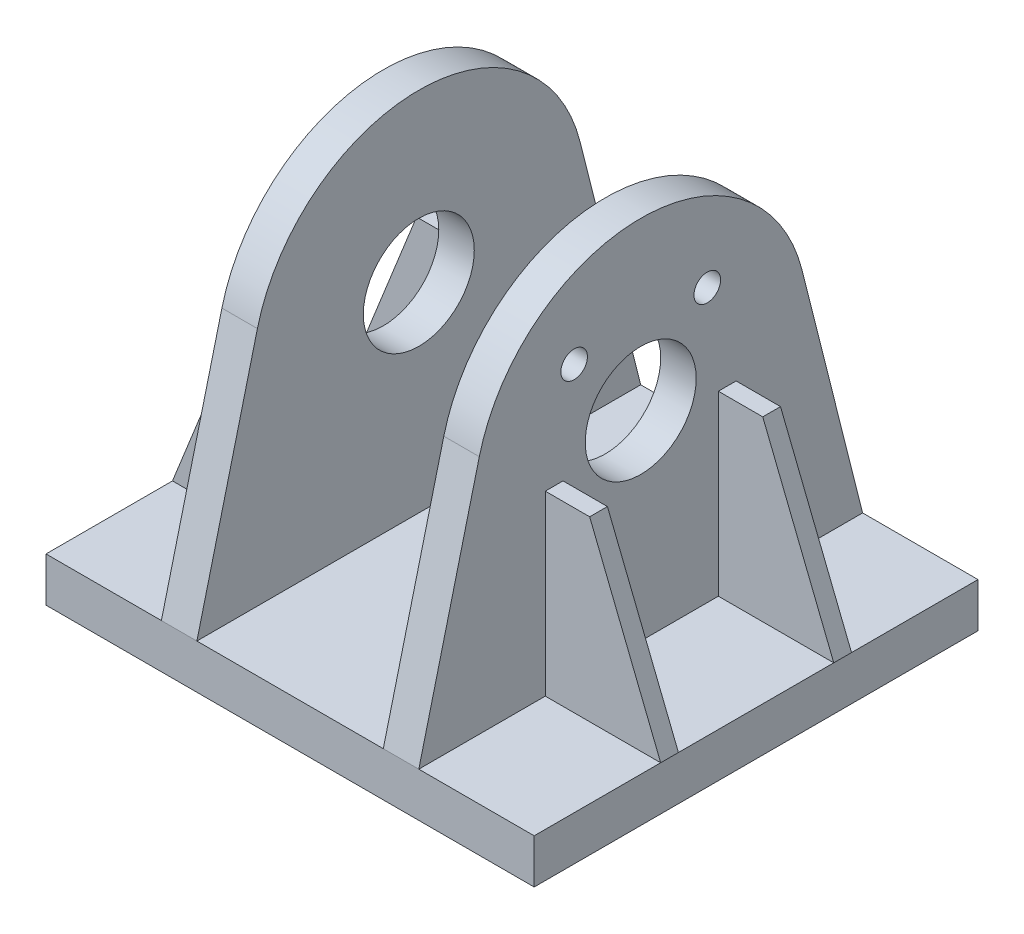
ISO-10303-21;
HEADER;
FILE_DESCRIPTION(('STEP AP214'),'2;1');
FILE_NAME('part.step','',(''),(''),'','','');
FILE_SCHEMA(('AUTOMOTIVE_DESIGN { 1 0 10303 214 1 1 1 1 }'));
ENDSEC;
DATA;
#1=APPLICATION_CONTEXT('core data for automotive mechanical design processes');
#2=APPLICATION_PROTOCOL_DEFINITION('international standard','automotive_design',2000,#1);
#3=PRODUCT_CONTEXT('',#1,'mechanical');
#4=PRODUCT('Part','Part','',(#3));
#5=PRODUCT_RELATED_PRODUCT_CATEGORY('part','',(#4));
#6=PRODUCT_DEFINITION_FORMATION('','',#4);
#7=PRODUCT_DEFINITION_CONTEXT('part definition',#1,'design');
#8=PRODUCT_DEFINITION('design','',#6,#7);
#9=PRODUCT_DEFINITION_SHAPE('','',#8);
#10=(LENGTH_UNIT() NAMED_UNIT(*) SI_UNIT(.MILLI.,.METRE.));
#11=(NAMED_UNIT(*) PLANE_ANGLE_UNIT() SI_UNIT($,.RADIAN.));
#12=(NAMED_UNIT(*) SI_UNIT($,.STERADIAN.) SOLID_ANGLE_UNIT());
#13=UNCERTAINTY_MEASURE_WITH_UNIT(LENGTH_MEASURE(1.E-05),#10,'distance_accuracy_value','');
#14=(GEOMETRIC_REPRESENTATION_CONTEXT(3) GLOBAL_UNCERTAINTY_ASSIGNED_CONTEXT((#13)) GLOBAL_UNIT_ASSIGNED_CONTEXT((#10,
#11,#12)) REPRESENTATION_CONTEXT('',''));
#15=CARTESIAN_POINT('',(0.,0.,0.));
#16=DIRECTION('',(0.,0.,1.));
#17=DIRECTION('',(1.,0.,0.));
#18=AXIS2_PLACEMENT_3D('',#15,#16,#17);
#19=CARTESIAN_POINT('',(-110.,20.,-100.));
#20=DIRECTION('',(1.,0.,0.));
#21=DIRECTION('',(0.,0.,-1.));
#22=AXIS2_PLACEMENT_3D('',#19,#20,#21);
#23=PLANE('',#22);
#24=DIRECTION('',(0.,0.,1.));
#25=VECTOR('',#24,1.);
#26=CARTESIAN_POINT('',(-110.,20.,-100.000125));
#27=LINE('',#26,#25);
#28=CARTESIAN_POINT('',(-110.,20.,-43.));
#29=VERTEX_POINT('',#28);
#30=CARTESIAN_POINT('',(-110.,20.,-35.));
#31=VERTEX_POINT('',#30);
#32=EDGE_CURVE('E224',#29,#31,#27,.T.);
#33=ORIENTED_EDGE('',*,*,#32,.F.);
#34=DIRECTION('',(0.,0.,1.));
#35=VECTOR('',#34,1.);
#36=CARTESIAN_POINT('',(-110.,20.,-100.));
#37=LINE('',#36,#35);
#38=CARTESIAN_POINT('',(-110.,20.,-100.));
#39=VERTEX_POINT('',#38);
#40=EDGE_CURVE('E254',#39,#29,#37,.T.);
#41=ORIENTED_EDGE('',*,*,#40,.F.);
#42=DIRECTION('',(0.,-1.,0.));
#43=VECTOR('',#42,1.);
#44=CARTESIAN_POINT('',(-110.,20.,-100.));
#45=LINE('',#44,#43);
#46=CARTESIAN_POINT('',(-110.,0.,-100.));
#47=VERTEX_POINT('',#46);
#48=EDGE_CURVE('E430',#39,#47,#45,.T.);
#49=ORIENTED_EDGE('',*,*,#48,.T.);
#50=DIRECTION('',(0.,0.,1.));
#51=VECTOR('',#50,1.);
#52=CARTESIAN_POINT('',(-110.,0.,-100.));
#53=LINE('',#52,#51);
#54=CARTESIAN_POINT('',(-110.,0.,100.));
#55=VERTEX_POINT('',#54);
#56=EDGE_CURVE('E435',#47,#55,#53,.T.);
#57=ORIENTED_EDGE('',*,*,#56,.T.);
#58=DIRECTION('',(0.,-1.,0.));
#59=VECTOR('',#58,1.);
#60=CARTESIAN_POINT('',(-110.,20.,100.));
#61=LINE('',#60,#59);
#62=CARTESIAN_POINT('',(-110.,20.,100.));
#63=VERTEX_POINT('',#62);
#64=EDGE_CURVE('E250',#63,#55,#61,.T.);
#65=ORIENTED_EDGE('',*,*,#64,.F.);
#66=CARTESIAN_POINT('',(-110.,20.,43.));
#67=VERTEX_POINT('',#66);
#68=EDGE_CURVE('E240',#67,#63,#37,.T.);
#69=ORIENTED_EDGE('',*,*,#68,.F.);
#70=CARTESIAN_POINT('',(-110.,20.,35.));
#71=VERTEX_POINT('',#70);
#72=EDGE_CURVE('E215',#71,#67,#27,.T.);
#73=ORIENTED_EDGE('',*,*,#72,.F.);
#74=EDGE_CURVE('E251',#31,#71,#37,.T.);
#75=ORIENTED_EDGE('',*,*,#74,.F.);
#76=EDGE_LOOP('',(#33,#41,#49,#57,#65,#69,#73,#75));
#77=FACE_BOUND('',#76,.T.);
#78=ADVANCED_FACE('F34',(#77),#23,.F.);
#79=CARTESIAN_POINT('',(-110.,100.,43.));
#80=DIRECTION('',(0.,0.,1.));
#81=DIRECTION('',(0.,-1.,0.));
#82=AXIS2_PLACEMENT_3D('',#79,#80,#81);
#83=PLANE('',#82);
#84=DIRECTION('',(1.,0.,0.));
#85=VECTOR('',#84,1.);
#86=CARTESIAN_POINT('',(-110.,100.,43.));
#87=LINE('',#86,#85);
#88=CARTESIAN_POINT('',(-78.,100.,43.));
#89=VERTEX_POINT('',#88);
#90=CARTESIAN_POINT('',(-58.,100.,43.));
#91=VERTEX_POINT('',#90);
#92=EDGE_CURVE('E233',#89,#91,#87,.T.);
#93=ORIENTED_EDGE('',*,*,#92,.F.);
#94=DIRECTION('',(-0.371390676354104,-0.928476690885259,0.));
#95=VECTOR('',#94,1.);
#96=CARTESIAN_POINT('',(-78.,100.,43.));
#97=LINE('',#96,#95);
#98=EDGE_CURVE('E218',#89,#67,#97,.T.);
#99=ORIENTED_EDGE('',*,*,#98,.T.);
#100=DIRECTION('',(1.,0.,0.));
#101=VECTOR('',#100,1.);
#102=CARTESIAN_POINT('',(-110.,20.,43.));
#103=LINE('',#102,#101);
#104=CARTESIAN_POINT('',(-58.,20.,43.));
#105=VERTEX_POINT('',#104);
#106=EDGE_CURVE('E231',#67,#105,#103,.T.);
#107=ORIENTED_EDGE('',*,*,#106,.T.);
#108=DIRECTION('',(0.,-1.,0.));
#109=VECTOR('',#108,1.);
#110=CARTESIAN_POINT('',(-58.,100.,43.));
#111=LINE('',#110,#109);
#112=EDGE_CURVE('E526',#91,#105,#111,.T.);
#113=ORIENTED_EDGE('',*,*,#112,.F.);
#114=EDGE_LOOP('',(#93,#99,#107,#113));
#115=FACE_BOUND('',#114,.T.);
#116=ADVANCED_FACE('F229',(#115),#83,.T.);
#117=CARTESIAN_POINT('',(-110.,100.,43.));
#118=DIRECTION('',(0.,1.,0.));
#119=DIRECTION('',(0.,0.,1.));
#120=AXIS2_PLACEMENT_3D('',#117,#118,#119);
#121=PLANE('',#120);
#122=DIRECTION('',(1.,0.,0.));
#123=VECTOR('',#122,1.);
#124=CARTESIAN_POINT('',(-110.,100.,35.));
#125=LINE('',#124,#123);
#126=CARTESIAN_POINT('',(-78.,100.,35.));
#127=VERTEX_POINT('',#126);
#128=CARTESIAN_POINT('',(-58.,100.,35.));
#129=VERTEX_POINT('',#128);
#130=EDGE_CURVE('E517',#127,#129,#125,.T.);
#131=ORIENTED_EDGE('',*,*,#130,.F.);
#132=DIRECTION('',(0.,0.,1.));
#133=VECTOR('',#132,1.);
#134=CARTESIAN_POINT('',(-78.,100.,-100.000125));
#135=LINE('',#134,#133);
#136=EDGE_CURVE('E48',#127,#89,#135,.T.);
#137=ORIENTED_EDGE('',*,*,#136,.T.);
#138=ORIENTED_EDGE('',*,*,#92,.T.);
#139=DIRECTION('',(0.,0.,1.));
#140=VECTOR('',#139,1.);
#141=CARTESIAN_POINT('',(-58.,100.,43.));
#142=LINE('',#141,#140);
#143=EDGE_CURVE('E523',#129,#91,#142,.T.);
#144=ORIENTED_EDGE('',*,*,#143,.F.);
#145=EDGE_LOOP('',(#131,#137,#138,#144));
#146=FACE_BOUND('',#145,.T.);
#147=ADVANCED_FACE('F638',(#146),#121,.T.);
#148=CARTESIAN_POINT('',(-110.,100.,35.));
#149=DIRECTION('',(0.,0.,-1.));
#150=DIRECTION('',(0.,1.,0.));
#151=AXIS2_PLACEMENT_3D('',#148,#149,#150);
#152=PLANE('',#151);
#153=DIRECTION('',(1.,0.,0.));
#154=VECTOR('',#153,1.);
#155=CARTESIAN_POINT('',(-110.,20.,35.));
#156=LINE('',#155,#154);
#157=CARTESIAN_POINT('',(-58.,20.,35.));
#158=VERTEX_POINT('',#157);
#159=EDGE_CURVE('E243',#71,#158,#156,.T.);
#160=ORIENTED_EDGE('',*,*,#159,.F.);
#161=DIRECTION('',(0.371390676354104,0.928476690885259,0.));
#162=VECTOR('',#161,1.);
#163=CARTESIAN_POINT('',(-82.4137931034483,88.9655172413793,35.));
#164=LINE('',#163,#162);
#165=EDGE_CURVE('E219',#71,#127,#164,.T.);
#166=ORIENTED_EDGE('',*,*,#165,.T.);
#167=ORIENTED_EDGE('',*,*,#130,.T.);
#168=DIRECTION('',(0.,1.,0.));
#169=VECTOR('',#168,1.);
#170=CARTESIAN_POINT('',(-58.,100.,35.));
#171=LINE('',#170,#169);
#172=EDGE_CURVE('E244',#158,#129,#171,.T.);
#173=ORIENTED_EDGE('',*,*,#172,.F.);
#174=EDGE_LOOP('',(#160,#166,#167,#173));
#175=FACE_BOUND('',#174,.T.);
#176=ADVANCED_FACE('F642',(#175),#152,.T.);
#177=CARTESIAN_POINT('',(-110.,100.,-35.));
#178=DIRECTION('',(0.,0.,1.));
#179=DIRECTION('',(0.,-1.,0.));
#180=AXIS2_PLACEMENT_3D('',#177,#178,#179);
#181=PLANE('',#180);
#182=DIRECTION('',(1.,0.,0.));
#183=VECTOR('',#182,1.);
#184=CARTESIAN_POINT('',(-110.,100.,-35.));
#185=LINE('',#184,#183);
#186=CARTESIAN_POINT('',(-78.,100.,-35.));
#187=VERTEX_POINT('',#186);
#188=CARTESIAN_POINT('',(-58.,100.,-35.));
#189=VERTEX_POINT('',#188);
#190=EDGE_CURVE('E528',#187,#189,#185,.T.);
#191=ORIENTED_EDGE('',*,*,#190,.F.);
#192=DIRECTION('',(-0.371390676354104,-0.928476690885259,0.));
#193=VECTOR('',#192,1.);
#194=CARTESIAN_POINT('',(-82.4137931034483,88.9655172413793,-35.));
#195=LINE('',#194,#193);
#196=EDGE_CURVE('E547',#187,#31,#195,.T.);
#197=ORIENTED_EDGE('',*,*,#196,.T.);
#198=DIRECTION('',(1.,0.,0.));
#199=VECTOR('',#198,1.);
#200=CARTESIAN_POINT('',(-110.,20.,-35.));
#201=LINE('',#200,#199);
#202=CARTESIAN_POINT('',(-58.,20.,-35.));
#203=VERTEX_POINT('',#202);
#204=EDGE_CURVE('E535',#31,#203,#201,.T.);
#205=ORIENTED_EDGE('',*,*,#204,.T.);
#206=DIRECTION('',(0.,-1.,0.));
#207=VECTOR('',#206,1.);
#208=CARTESIAN_POINT('',(-58.,100.,-35.));
#209=LINE('',#208,#207);
#210=EDGE_CURVE('E543',#189,#203,#209,.T.);
#211=ORIENTED_EDGE('',*,*,#210,.F.);
#212=EDGE_LOOP('',(#191,#197,#205,#211));
#213=FACE_BOUND('',#212,.T.);
#214=ADVANCED_FACE('F648',(#213),#181,.T.);
#215=CARTESIAN_POINT('',(-110.,100.,-35.));
#216=DIRECTION('',(0.,1.,0.));
#217=DIRECTION('',(0.,0.,1.));
#218=AXIS2_PLACEMENT_3D('',#215,#216,#217);
#219=PLANE('',#218);
#220=DIRECTION('',(1.,0.,0.));
#221=VECTOR('',#220,1.);
#222=CARTESIAN_POINT('',(-110.,100.,-43.));
#223=LINE('',#222,#221);
#224=CARTESIAN_POINT('',(-78.,100.,-43.));
#225=VERTEX_POINT('',#224);
#226=CARTESIAN_POINT('',(-58.,100.,-43.));
#227=VERTEX_POINT('',#226);
#228=EDGE_CURVE('E530',#225,#227,#223,.T.);
#229=ORIENTED_EDGE('',*,*,#228,.F.);
#230=EDGE_CURVE('E56',#225,#187,#135,.T.);
#231=ORIENTED_EDGE('',*,*,#230,.T.);
#232=ORIENTED_EDGE('',*,*,#190,.T.);
#233=DIRECTION('',(0.,0.,1.));
#234=VECTOR('',#233,1.);
#235=CARTESIAN_POINT('',(-58.,100.,-35.));
#236=LINE('',#235,#234);
#237=EDGE_CURVE('E540',#227,#189,#236,.T.);
#238=ORIENTED_EDGE('',*,*,#237,.F.);
#239=EDGE_LOOP('',(#229,#231,#232,#238));
#240=FACE_BOUND('',#239,.T.);
#241=ADVANCED_FACE('F652',(#240),#219,.T.);
#242=CARTESIAN_POINT('',(-110.,100.,-43.));
#243=DIRECTION('',(0.,0.,-1.));
#244=DIRECTION('',(0.,1.,0.));
#245=AXIS2_PLACEMENT_3D('',#242,#243,#244);
#246=PLANE('',#245);
#247=DIRECTION('',(1.,0.,0.));
#248=VECTOR('',#247,1.);
#249=CARTESIAN_POINT('',(-110.,20.,-43.));
#250=LINE('',#249,#248);
#251=CARTESIAN_POINT('',(-58.,20.,-43.));
#252=VERTEX_POINT('',#251);
#253=EDGE_CURVE('E532',#29,#252,#250,.T.);
#254=ORIENTED_EDGE('',*,*,#253,.F.);
#255=DIRECTION('',(0.371390676354104,0.928476690885259,0.));
#256=VECTOR('',#255,1.);
#257=CARTESIAN_POINT('',(-82.4137931034483,88.9655172413793,-43.));
#258=LINE('',#257,#256);
#259=EDGE_CURVE('E11',#29,#225,#258,.T.);
#260=ORIENTED_EDGE('',*,*,#259,.T.);
#261=ORIENTED_EDGE('',*,*,#228,.T.);
#262=DIRECTION('',(0.,1.,0.));
#263=VECTOR('',#262,1.);
#264=CARTESIAN_POINT('',(-58.,100.,-43.));
#265=LINE('',#264,#263);
#266=EDGE_CURVE('E537',#252,#227,#265,.T.);
#267=ORIENTED_EDGE('',*,*,#266,.F.);
#268=EDGE_LOOP('',(#254,#260,#261,#267));
#269=FACE_BOUND('',#268,.T.);
#270=ADVANCED_FACE('F656',(#269),#246,.T.);
#271=CARTESIAN_POINT('',(0.,20.,0.));
#272=DIRECTION('',(0.,1.,0.));
#273=DIRECTION('',(0.,0.,1.));
#274=AXIS2_PLACEMENT_3D('',#271,#272,#273);
#275=PLANE('',#274);
#276=ORIENTED_EDGE('',*,*,#204,.F.);
#277=ORIENTED_EDGE('',*,*,#74,.T.);
#278=ORIENTED_EDGE('',*,*,#159,.T.);
#279=DIRECTION('',(0.,0.,1.));
#280=VECTOR('',#279,1.);
#281=CARTESIAN_POINT('',(-58.,20.,-100.));
#282=LINE('',#281,#280);
#283=EDGE_CURVE('E262',#203,#158,#282,.T.);
#284=ORIENTED_EDGE('',*,*,#283,.F.);
#285=EDGE_LOOP('',(#276,#277,#278,#284));
#286=FACE_BOUND('',#285,.T.);
#287=ADVANCED_FACE('F660',(#286),#275,.T.);
#288=ORIENTED_EDGE('',*,*,#106,.F.);
#289=ORIENTED_EDGE('',*,*,#68,.T.);
#290=DIRECTION('',(1.,0.,0.));
#291=VECTOR('',#290,1.);
#292=CARTESIAN_POINT('',(-110.,20.,100.));
#293=LINE('',#292,#291);
#294=CARTESIAN_POINT('',(-58.,20.,100.));
#295=VERTEX_POINT('',#294);
#296=EDGE_CURVE('E423',#63,#295,#293,.T.);
#297=ORIENTED_EDGE('',*,*,#296,.T.);
#298=EDGE_CURVE('E242',#105,#295,#282,.T.);
#299=ORIENTED_EDGE('',*,*,#298,.F.);
#300=EDGE_LOOP('',(#288,#289,#297,#299));
#301=FACE_BOUND('',#300,.T.);
#302=ADVANCED_FACE('F238',(#301),#275,.T.);
#303=DIRECTION('',(0.,0.,-1.));
#304=VECTOR('',#303,1.);
#305=CARTESIAN_POINT('',(110.,20.,-100.));
#306=LINE('',#305,#304);
#307=CARTESIAN_POINT('',(110.,20.,35.));
#308=VERTEX_POINT('',#307);
#309=CARTESIAN_POINT('',(110.,20.,-35.));
#310=VERTEX_POINT('',#309);
#311=EDGE_CURVE('E458',#308,#310,#306,.T.);
#312=ORIENTED_EDGE('',*,*,#311,.T.);
#313=DIRECTION('',(-1.,0.,0.));
#314=VECTOR('',#313,1.);
#315=CARTESIAN_POINT('',(110.,20.,-35.));
#316=LINE('',#315,#314);
#317=CARTESIAN_POINT('',(58.,20.,-35.));
#318=VERTEX_POINT('',#317);
#319=EDGE_CURVE('E293',#310,#318,#316,.T.);
#320=ORIENTED_EDGE('',*,*,#319,.T.);
#321=DIRECTION('',(0.,0.,-1.));
#322=VECTOR('',#321,1.);
#323=CARTESIAN_POINT('',(58.,20.,-100.));
#324=LINE('',#323,#322);
#325=CARTESIAN_POINT('',(58.,20.,35.));
#326=VERTEX_POINT('',#325);
#327=EDGE_CURVE('E395',#326,#318,#324,.T.);
#328=ORIENTED_EDGE('',*,*,#327,.F.);
#329=DIRECTION('',(-1.,0.,0.));
#330=VECTOR('',#329,1.);
#331=CARTESIAN_POINT('',(110.,20.,35.));
#332=LINE('',#331,#330);
#333=EDGE_CURVE('E313',#308,#326,#332,.T.);
#334=ORIENTED_EDGE('',*,*,#333,.F.);
#335=EDGE_LOOP('',(#312,#320,#328,#334));
#336=FACE_BOUND('',#335,.T.);
#337=ADVANCED_FACE('F621',(#336),#275,.T.);
#338=CARTESIAN_POINT('',(58.,20.,-43.));
#339=VERTEX_POINT('',#338);
#340=CARTESIAN_POINT('',(58.,20.,-100.));
#341=VERTEX_POINT('',#340);
#342=EDGE_CURVE('E392',#339,#341,#324,.T.);
#343=ORIENTED_EDGE('',*,*,#342,.F.);
#344=DIRECTION('',(-1.,0.,0.));
#345=VECTOR('',#344,1.);
#346=CARTESIAN_POINT('',(110.,20.,-43.));
#347=LINE('',#346,#345);
#348=CARTESIAN_POINT('',(110.,20.,-43.));
#349=VERTEX_POINT('',#348);
#350=EDGE_CURVE('E291',#349,#339,#347,.T.);
#351=ORIENTED_EDGE('',*,*,#350,.F.);
#352=CARTESIAN_POINT('',(110.,20.,-100.));
#353=VERTEX_POINT('',#352);
#354=EDGE_CURVE('E425',#349,#353,#306,.T.);
#355=ORIENTED_EDGE('',*,*,#354,.T.);
#356=DIRECTION('',(-1.,0.,0.));
#357=VECTOR('',#356,1.);
#358=CARTESIAN_POINT('',(-110.,20.,-100.));
#359=LINE('',#358,#357);
#360=EDGE_CURVE('E440',#353,#341,#359,.T.);
#361=ORIENTED_EDGE('',*,*,#360,.T.);
#362=EDGE_LOOP('',(#343,#351,#355,#361));
#363=FACE_BOUND('',#362,.T.);
#364=ADVANCED_FACE('F465',(#363),#275,.T.);
#365=CARTESIAN_POINT('',(58.,220.,-100.));
#366=DIRECTION('',(-1.,0.,0.));
#367=DIRECTION('',(0.,0.,1.));
#368=AXIS2_PLACEMENT_3D('',#365,#366,#367);
#369=PLANE('',#368);
#370=CARTESIAN_POINT('',(58.,143.,-30.));
#371=DIRECTION('',(1.,0.,0.));
#372=DIRECTION('',(0.,0.,-1.));
#373=AXIS2_PLACEMENT_3D('',#370,#371,#372);
#374=CIRCLE('',#373,6.);
#375=CARTESIAN_POINT('',(58.,143.,-36.));
#376=VERTEX_POINT('',#375);
#377=EDGE_CURVE('E561',#376,#376,#374,.T.);
#378=ORIENTED_EDGE('',*,*,#377,.F.);
#379=EDGE_LOOP('',(#378));
#380=FACE_BOUND('',#379,.T.);
#381=CARTESIAN_POINT('',(58.,143.,30.));
#382=DIRECTION('',(1.,0.,0.));
#383=DIRECTION('',(0.,0.,-1.));
#384=AXIS2_PLACEMENT_3D('',#381,#382,#383);
#385=CIRCLE('',#384,6.);
#386=CARTESIAN_POINT('',(58.,143.,24.));
#387=VERTEX_POINT('',#386);
#388=EDGE_CURVE('E555',#387,#387,#385,.T.);
#389=ORIENTED_EDGE('',*,*,#388,.F.);
#390=EDGE_LOOP('',(#389));
#391=FACE_BOUND('',#390,.T.);
#392=CARTESIAN_POINT('',(58.,110.,0.));
#393=DIRECTION('',(1.,0.,0.));
#394=DIRECTION('',(0.,0.,-1.));
#395=AXIS2_PLACEMENT_3D('',#392,#393,#394);
#396=CIRCLE('',#395,25.);
#397=CARTESIAN_POINT('',(58.,110.,-25.));
#398=VERTEX_POINT('',#397);
#399=EDGE_CURVE('E377',#398,#398,#396,.T.);
#400=ORIENTED_EDGE('',*,*,#399,.F.);
#401=EDGE_LOOP('',(#400));
#402=FACE_BOUND('',#401,.T.);
#403=DIRECTION('',(0.,-1.,0.));
#404=VECTOR('',#403,1.);
#405=CARTESIAN_POINT('',(58.,100.,-35.));
#406=LINE('',#405,#404);
#407=CARTESIAN_POINT('',(58.,100.,-35.));
#408=VERTEX_POINT('',#407);
#409=EDGE_CURVE('E492',#408,#318,#406,.T.);
#410=ORIENTED_EDGE('',*,*,#409,.F.);
#411=DIRECTION('',(0.,0.,1.));
#412=VECTOR('',#411,1.);
#413=CARTESIAN_POINT('',(58.,100.,-35.));
#414=LINE('',#413,#412);
#415=CARTESIAN_POINT('',(58.,100.,-43.));
#416=VERTEX_POINT('',#415);
#417=EDGE_CURVE('E295',#416,#408,#414,.T.);
#418=ORIENTED_EDGE('',*,*,#417,.F.);
#419=DIRECTION('',(0.,1.,0.));
#420=VECTOR('',#419,1.);
#421=CARTESIAN_POINT('',(58.,100.,-43.));
#422=LINE('',#421,#420);
#423=EDGE_CURVE('E290',#339,#416,#422,.T.);
#424=ORIENTED_EDGE('',*,*,#423,.F.);
#425=ORIENTED_EDGE('',*,*,#342,.T.);
#426=DIRECTION('',(0.,-0.969736936832039,-0.244152152035599));
#427=VECTOR('',#426,1.);
#428=CARTESIAN_POINT('',(58.,20.,-100.));
#429=LINE('',#428,#427);
#430=CARTESIAN_POINT('',(58.,128.31141140267,-72.7302702624029));
#431=VERTEX_POINT('',#430);
#432=EDGE_CURVE('E320',#431,#341,#429,.T.);
#433=ORIENTED_EDGE('',*,*,#432,.F.);
#434=CARTESIAN_POINT('',(58.,110.,0.));
#435=DIRECTION('',(-1.,0.,0.));
#436=DIRECTION('',(0.,0.,-1.));
#437=AXIS2_PLACEMENT_3D('',#434,#435,#436);
#438=CIRCLE('',#437,75.);
#439=CARTESIAN_POINT('',(58.,128.31141140267,72.7302702624029));
#440=VERTEX_POINT('',#439);
#441=EDGE_CURVE('E318',#440,#431,#438,.T.);
#442=ORIENTED_EDGE('',*,*,#441,.F.);
#443=DIRECTION('',(0.,0.969736936832039,-0.244152152035599));
#444=VECTOR('',#443,1.);
#445=CARTESIAN_POINT('',(58.,128.31141140267,72.7302702624029));
#446=LINE('',#445,#444);
#447=CARTESIAN_POINT('',(58.,20.,100.));
#448=VERTEX_POINT('',#447);
#449=EDGE_CURVE('E323',#448,#440,#446,.T.);
#450=ORIENTED_EDGE('',*,*,#449,.F.);
#451=CARTESIAN_POINT('',(58.,20.,43.));
#452=VERTEX_POINT('',#451);
#453=EDGE_CURVE('E393',#448,#452,#324,.T.);
#454=ORIENTED_EDGE('',*,*,#453,.T.);
#455=DIRECTION('',(0.,-1.,0.));
#456=VECTOR('',#455,1.);
#457=CARTESIAN_POINT('',(58.,100.,43.));
#458=LINE('',#457,#456);
#459=CARTESIAN_POINT('',(58.,100.,43.));
#460=VERTEX_POINT('',#459);
#461=EDGE_CURVE('E300',#460,#452,#458,.T.);
#462=ORIENTED_EDGE('',*,*,#461,.F.);
#463=DIRECTION('',(0.,0.,1.));
#464=VECTOR('',#463,1.);
#465=CARTESIAN_POINT('',(58.,100.,43.));
#466=LINE('',#465,#464);
#467=CARTESIAN_POINT('',(58.,100.,35.));
#468=VERTEX_POINT('',#467);
#469=EDGE_CURVE('E306',#468,#460,#466,.T.);
#470=ORIENTED_EDGE('',*,*,#469,.F.);
#471=DIRECTION('',(0.,1.,0.));
#472=VECTOR('',#471,1.);
#473=CARTESIAN_POINT('',(58.,100.,35.));
#474=LINE('',#473,#472);
#475=EDGE_CURVE('E303',#326,#468,#474,.T.);
#476=ORIENTED_EDGE('',*,*,#475,.F.);
#477=ORIENTED_EDGE('',*,*,#327,.T.);
#478=EDGE_LOOP('',(#410,#418,#424,#425,#433,#442,#450,#454,#462,#470,#476,#477));
#479=FACE_BOUND('',#478,.T.);
#480=ADVANCED_FACE('F487',(#380,#391,#402,#479),#369,.F.);
#481=CARTESIAN_POINT('',(110.,20.,100.));
#482=VERTEX_POINT('',#481);
#483=CARTESIAN_POINT('',(110.,20.,43.));
#484=VERTEX_POINT('',#483);
#485=EDGE_CURVE('E417',#482,#484,#306,.T.);
#486=ORIENTED_EDGE('',*,*,#485,.T.);
#487=DIRECTION('',(-1.,0.,0.));
#488=VECTOR('',#487,1.);
#489=CARTESIAN_POINT('',(110.,20.,43.));
#490=LINE('',#489,#488);
#491=EDGE_CURVE('E316',#484,#452,#490,.T.);
#492=ORIENTED_EDGE('',*,*,#491,.T.);
#493=ORIENTED_EDGE('',*,*,#453,.F.);
#494=EDGE_CURVE('E409',#448,#482,#293,.T.);
#495=ORIENTED_EDGE('',*,*,#494,.T.);
#496=EDGE_LOOP('',(#486,#492,#493,#495));
#497=FACE_BOUND('',#496,.T.);
#498=ADVANCED_FACE('F579',(#497),#275,.T.);
#499=CARTESIAN_POINT('',(-42.,20.,100.));
#500=VERTEX_POINT('',#499);
#501=CARTESIAN_POINT('',(42.,20.,100.));
#502=VERTEX_POINT('',#501);
#503=EDGE_CURVE('E411',#500,#502,#293,.T.);
#504=ORIENTED_EDGE('',*,*,#503,.T.);
#505=DIRECTION('',(0.,0.,1.));
#506=VECTOR('',#505,1.);
#507=CARTESIAN_POINT('',(42.,20.,-100.));
#508=LINE('',#507,#506);
#509=CARTESIAN_POINT('',(42.,20.,-100.));
#510=VERTEX_POINT('',#509);
#511=EDGE_CURVE('E389',#510,#502,#508,.T.);
#512=ORIENTED_EDGE('',*,*,#511,.F.);
#513=CARTESIAN_POINT('',(-42.,20.,-100.));
#514=VERTEX_POINT('',#513);
#515=EDGE_CURVE('E412',#510,#514,#359,.T.);
#516=ORIENTED_EDGE('',*,*,#515,.T.);
#517=DIRECTION('',(0.,0.,-1.));
#518=VECTOR('',#517,1.);
#519=CARTESIAN_POINT('',(-42.,20.,-100.));
#520=LINE('',#519,#518);
#521=EDGE_CURVE('E407',#500,#514,#520,.T.);
#522=ORIENTED_EDGE('',*,*,#521,.F.);
#523=EDGE_LOOP('',(#504,#512,#516,#522));
#524=FACE_BOUND('',#523,.T.);
#525=ADVANCED_FACE('F597',(#524),#275,.T.);
#526=ORIENTED_EDGE('',*,*,#253,.T.);
#527=CARTESIAN_POINT('',(-58.,20.,-100.));
#528=VERTEX_POINT('',#527);
#529=EDGE_CURVE('E403',#528,#252,#282,.T.);
#530=ORIENTED_EDGE('',*,*,#529,.F.);
#531=EDGE_CURVE('E439',#528,#39,#359,.T.);
#532=ORIENTED_EDGE('',*,*,#531,.T.);
#533=ORIENTED_EDGE('',*,*,#40,.T.);
#534=EDGE_LOOP('',(#526,#530,#532,#533));
#535=FACE_BOUND('',#534,.T.);
#536=ADVANCED_FACE('F747',(#535),#275,.T.);
#537=CARTESIAN_POINT('',(-110.,20.,100.));
#538=DIRECTION('',(0.,0.,-1.));
#539=DIRECTION('',(-1.,0.,0.));
#540=AXIS2_PLACEMENT_3D('',#537,#538,#539);
#541=PLANE('',#540);
#542=ORIENTED_EDGE('',*,*,#494,.F.);
#543=DIRECTION('',(1.,0.,0.));
#544=VECTOR('',#543,1.);
#545=CARTESIAN_POINT('',(-110.000025,20.,100.));
#546=LINE('',#545,#544);
#547=EDGE_CURVE('E339',#502,#448,#546,.T.);
#548=ORIENTED_EDGE('',*,*,#547,.F.);
#549=ORIENTED_EDGE('',*,*,#503,.F.);
#550=EDGE_CURVE('E330',#295,#500,#546,.T.);
#551=ORIENTED_EDGE('',*,*,#550,.F.);
#552=ORIENTED_EDGE('',*,*,#296,.F.);
#553=ORIENTED_EDGE('',*,*,#64,.T.);
#554=DIRECTION('',(1.,0.,0.));
#555=VECTOR('',#554,1.);
#556=CARTESIAN_POINT('',(-110.,0.,100.));
#557=LINE('',#556,#555);
#558=CARTESIAN_POINT('',(110.,0.,100.));
#559=VERTEX_POINT('',#558);
#560=EDGE_CURVE('E433',#55,#559,#557,.T.);
#561=ORIENTED_EDGE('',*,*,#560,.T.);
#562=DIRECTION('',(0.,-1.,0.));
#563=VECTOR('',#562,1.);
#564=CARTESIAN_POINT('',(110.,20.,100.));
#565=LINE('',#564,#563);
#566=EDGE_CURVE('E270',#482,#559,#565,.T.);
#567=ORIENTED_EDGE('',*,*,#566,.F.);
#568=EDGE_LOOP('',(#542,#548,#549,#551,#552,#553,#561,#567));
#569=FACE_BOUND('',#568,.T.);
#570=ADVANCED_FACE('F603',(#569),#541,.F.);
#571=CARTESIAN_POINT('',(110.,20.,-100.));
#572=DIRECTION('',(-1.,0.,0.));
#573=DIRECTION('',(0.,0.,1.));
#574=AXIS2_PLACEMENT_3D('',#571,#572,#573);
#575=PLANE('',#574);
#576=ORIENTED_EDGE('',*,*,#354,.F.);
#577=DIRECTION('',(0.,0.,1.));
#578=VECTOR('',#577,1.);
#579=CARTESIAN_POINT('',(110.,20.,-100.000125));
#580=LINE('',#579,#578);
#581=EDGE_CURVE('E508',#349,#310,#580,.T.);
#582=ORIENTED_EDGE('',*,*,#581,.T.);
#583=ORIENTED_EDGE('',*,*,#311,.F.);
#584=EDGE_CURVE('E511',#308,#484,#580,.T.);
#585=ORIENTED_EDGE('',*,*,#584,.T.);
#586=ORIENTED_EDGE('',*,*,#485,.F.);
#587=ORIENTED_EDGE('',*,*,#566,.T.);
#588=DIRECTION('',(0.,0.,-1.));
#589=VECTOR('',#588,1.);
#590=CARTESIAN_POINT('',(110.,0.,-100.));
#591=LINE('',#590,#589);
#592=CARTESIAN_POINT('',(110.,0.,-100.));
#593=VERTEX_POINT('',#592);
#594=EDGE_CURVE('E255',#559,#593,#591,.T.);
#595=ORIENTED_EDGE('',*,*,#594,.T.);
#596=DIRECTION('',(0.,-1.,0.));
#597=VECTOR('',#596,1.);
#598=CARTESIAN_POINT('',(110.,20.,-100.));
#599=LINE('',#598,#597);
#600=EDGE_CURVE('E428',#353,#593,#599,.T.);
#601=ORIENTED_EDGE('',*,*,#600,.F.);
#602=EDGE_LOOP('',(#576,#582,#583,#585,#586,#587,#595,#601));
#603=FACE_BOUND('',#602,.T.);
#604=ADVANCED_FACE('F468',(#603),#575,.F.);
#605=CARTESIAN_POINT('',(-110.,20.,-100.));
#606=DIRECTION('',(0.,0.,1.));
#607=DIRECTION('',(1.,0.,0.));
#608=AXIS2_PLACEMENT_3D('',#605,#606,#607);
#609=PLANE('',#608);
#610=ORIENTED_EDGE('',*,*,#531,.F.);
#611=DIRECTION('',(1.,0.,0.));
#612=VECTOR('',#611,1.);
#613=CARTESIAN_POINT('',(-110.000025,20.,-100.));
#614=LINE('',#613,#612);
#615=EDGE_CURVE('E341',#528,#514,#614,.T.);
#616=ORIENTED_EDGE('',*,*,#615,.T.);
#617=ORIENTED_EDGE('',*,*,#515,.F.);
#618=EDGE_CURVE('E474',#510,#341,#614,.T.);
#619=ORIENTED_EDGE('',*,*,#618,.T.);
#620=ORIENTED_EDGE('',*,*,#360,.F.);
#621=ORIENTED_EDGE('',*,*,#600,.T.);
#622=DIRECTION('',(-1.,0.,0.));
#623=VECTOR('',#622,1.);
#624=CARTESIAN_POINT('',(-110.,0.,-100.));
#625=LINE('',#624,#623);
#626=EDGE_CURVE('E252',#593,#47,#625,.T.);
#627=ORIENTED_EDGE('',*,*,#626,.T.);
#628=ORIENTED_EDGE('',*,*,#48,.F.);
#629=EDGE_LOOP('',(#610,#616,#617,#619,#620,#621,#627,#628));
#630=FACE_BOUND('',#629,.T.);
#631=ADVANCED_FACE('F473',(#630),#609,.F.);
#632=CARTESIAN_POINT('',(0.,0.,0.));
#633=DIRECTION('',(0.,1.,0.));
#634=DIRECTION('',(0.,0.,1.));
#635=AXIS2_PLACEMENT_3D('',#632,#633,#634);
#636=PLANE('',#635);
#637=ORIENTED_EDGE('',*,*,#56,.F.);
#638=ORIENTED_EDGE('',*,*,#626,.F.);
#639=ORIENTED_EDGE('',*,*,#594,.F.);
#640=ORIENTED_EDGE('',*,*,#560,.F.);
#641=EDGE_LOOP('',(#637,#638,#639,#640));
#642=FACE_BOUND('',#641,.T.);
#643=ADVANCED_FACE('F762',(#642),#636,.F.);
#644=CARTESIAN_POINT('',(-58.,220.,-100.));
#645=DIRECTION('',(1.,0.,0.));
#646=DIRECTION('',(0.,0.,-1.));
#647=AXIS2_PLACEMENT_3D('',#644,#645,#646);
#648=PLANE('',#647);
#649=CARTESIAN_POINT('',(-58.,110.,0.));
#650=DIRECTION('',(1.,0.,0.));
#651=DIRECTION('',(0.,0.,-1.));
#652=AXIS2_PLACEMENT_3D('',#649,#650,#651);
#653=CIRCLE('',#652,25.);
#654=CARTESIAN_POINT('',(-58.,110.,-25.));
#655=VERTEX_POINT('',#654);
#656=EDGE_CURVE('E386',#655,#655,#653,.T.);
#657=ORIENTED_EDGE('',*,*,#656,.T.);
#658=EDGE_LOOP('',(#657));
#659=FACE_BOUND('',#658,.T.);
#660=ORIENTED_EDGE('',*,*,#237,.T.);
#661=ORIENTED_EDGE('',*,*,#210,.T.);
#662=ORIENTED_EDGE('',*,*,#283,.T.);
#663=ORIENTED_EDGE('',*,*,#172,.T.);
#664=ORIENTED_EDGE('',*,*,#143,.T.);
#665=ORIENTED_EDGE('',*,*,#112,.T.);
#666=ORIENTED_EDGE('',*,*,#298,.T.);
#667=DIRECTION('',(0.,0.969736936832039,-0.244152152035599));
#668=VECTOR('',#667,1.);
#669=CARTESIAN_POINT('',(-58.,255.430617338468,40.7252733240868));
#670=LINE('',#669,#668);
#671=CARTESIAN_POINT('',(-58.,128.31141140267,72.7302702624029));
#672=VERTEX_POINT('',#671);
#673=EDGE_CURVE('E361',#295,#672,#670,.T.);
#674=ORIENTED_EDGE('',*,*,#673,.T.);
#675=CARTESIAN_POINT('',(-58.,110.,0.));
#676=DIRECTION('',(1.,0.,0.));
#677=DIRECTION('',(0.,0.,-1.));
#678=AXIS2_PLACEMENT_3D('',#675,#676,#677);
#679=CIRCLE('',#678,75.);
#680=CARTESIAN_POINT('',(-58.,128.31141140267,-72.7302702624029));
#681=VERTEX_POINT('',#680);
#682=EDGE_CURVE('E374',#672,#681,#679,.F.);
#683=ORIENTED_EDGE('',*,*,#682,.T.);
#684=DIRECTION('',(0.,-0.969736936832039,-0.244152152035599));
#685=VECTOR('',#684,1.);
#686=CARTESIAN_POINT('',(-58.,208.077945331277,-52.6473279928096));
#687=LINE('',#686,#685);
#688=EDGE_CURVE('E348',#681,#528,#687,.T.);
#689=ORIENTED_EDGE('',*,*,#688,.T.);
#690=ORIENTED_EDGE('',*,*,#529,.T.);
#691=ORIENTED_EDGE('',*,*,#266,.T.);
#692=EDGE_LOOP('',(#660,#661,#662,#663,#664,#665,#666,#674,#683,#689,#690,#691));
#693=FACE_BOUND('',#692,.T.);
#694=ADVANCED_FACE('F758',(#659,#693),#648,.F.);
#695=CARTESIAN_POINT('',(-42.,220.,-100.));
#696=DIRECTION('',(-1.,0.,0.));
#697=DIRECTION('',(0.,0.,1.));
#698=AXIS2_PLACEMENT_3D('',#695,#696,#697);
#699=PLANE('',#698);
#700=CARTESIAN_POINT('',(-42.,110.,0.));
#701=DIRECTION('',(-1.,0.,0.));
#702=DIRECTION('',(0.,0.,1.));
#703=AXIS2_PLACEMENT_3D('',#700,#701,#702);
#704=CIRCLE('',#703,25.);
#705=CARTESIAN_POINT('',(-42.,110.,25.));
#706=VERTEX_POINT('',#705);
#707=EDGE_CURVE('E383',#706,#706,#704,.T.);
#708=ORIENTED_EDGE('',*,*,#707,.T.);
#709=EDGE_LOOP('',(#708));
#710=FACE_BOUND('',#709,.T.);
#711=CARTESIAN_POINT('',(-42.,110.,0.));
#712=DIRECTION('',(-1.,0.,0.));
#713=DIRECTION('',(0.,0.,1.));
#714=AXIS2_PLACEMENT_3D('',#711,#712,#713);
#715=CIRCLE('',#714,75.);
#716=CARTESIAN_POINT('',(-42.,128.31141140267,-72.7302702624029));
#717=VERTEX_POINT('',#716);
#718=CARTESIAN_POINT('',(-42.,128.31141140267,72.7302702624029));
#719=VERTEX_POINT('',#718);
#720=EDGE_CURVE('E371',#717,#719,#715,.F.);
#721=ORIENTED_EDGE('',*,*,#720,.T.);
#722=DIRECTION('',(0.,-0.969736936832039,0.244152152035599));
#723=VECTOR('',#722,1.);
#724=CARTESIAN_POINT('',(-42.,255.430617338468,40.7252733240868));
#725=LINE('',#724,#723);
#726=EDGE_CURVE('E358',#719,#500,#725,.T.);
#727=ORIENTED_EDGE('',*,*,#726,.T.);
#728=ORIENTED_EDGE('',*,*,#521,.T.);
#729=DIRECTION('',(0.,0.969736936832039,0.244152152035599));
#730=VECTOR('',#729,1.);
#731=CARTESIAN_POINT('',(-42.,208.077945331277,-52.6473279928096));
#732=LINE('',#731,#730);
#733=EDGE_CURVE('E345',#514,#717,#732,.T.);
#734=ORIENTED_EDGE('',*,*,#733,.T.);
#735=EDGE_LOOP('',(#721,#727,#728,#734));
#736=FACE_BOUND('',#735,.T.);
#737=ADVANCED_FACE('F594',(#710,#736),#699,.F.);
#738=CARTESIAN_POINT('',(42.,220.,-100.));
#739=DIRECTION('',(1.,0.,0.));
#740=DIRECTION('',(0.,0.,-1.));
#741=AXIS2_PLACEMENT_3D('',#738,#739,#740);
#742=PLANE('',#741);
#743=CARTESIAN_POINT('',(42.,143.,-30.));
#744=DIRECTION('',(1.,0.,0.));
#745=DIRECTION('',(0.,0.,-1.));
#746=AXIS2_PLACEMENT_3D('',#743,#744,#745);
#747=CIRCLE('',#746,6.);
#748=CARTESIAN_POINT('',(42.,143.,-36.));
#749=VERTEX_POINT('',#748);
#750=EDGE_CURVE('E558',#749,#749,#747,.T.);
#751=ORIENTED_EDGE('',*,*,#750,.T.);
#752=EDGE_LOOP('',(#751));
#753=FACE_BOUND('',#752,.T.);
#754=CARTESIAN_POINT('',(42.,143.,30.));
#755=DIRECTION('',(1.,0.,0.));
#756=DIRECTION('',(0.,0.,-1.));
#757=AXIS2_PLACEMENT_3D('',#754,#755,#756);
#758=CIRCLE('',#757,6.);
#759=CARTESIAN_POINT('',(42.,143.,24.));
#760=VERTEX_POINT('',#759);
#761=EDGE_CURVE('E234',#760,#760,#758,.T.);
#762=ORIENTED_EDGE('',*,*,#761,.T.);
#763=EDGE_LOOP('',(#762));
#764=FACE_BOUND('',#763,.T.);
#765=CARTESIAN_POINT('',(42.,110.,0.));
#766=DIRECTION('',(1.,0.,0.));
#767=DIRECTION('',(0.,0.,-1.));
#768=AXIS2_PLACEMENT_3D('',#765,#766,#767);
#769=CIRCLE('',#768,25.);
#770=CARTESIAN_POINT('',(42.,110.,-25.));
#771=VERTEX_POINT('',#770);
#772=EDGE_CURVE('E380',#771,#771,#769,.T.);
#773=ORIENTED_EDGE('',*,*,#772,.T.);
#774=EDGE_LOOP('',(#773));
#775=FACE_BOUND('',#774,.T.);
#776=ORIENTED_EDGE('',*,*,#511,.T.);
#777=DIRECTION('',(0.,0.969736936832039,-0.244152152035599));
#778=VECTOR('',#777,1.);
#779=CARTESIAN_POINT('',(42.,255.430617338468,40.7252733240868));
#780=LINE('',#779,#778);
#781=CARTESIAN_POINT('',(42.,128.31141140267,72.7302702624029));
#782=VERTEX_POINT('',#781);
#783=EDGE_CURVE('E353',#502,#782,#780,.T.);
#784=ORIENTED_EDGE('',*,*,#783,.T.);
#785=CARTESIAN_POINT('',(42.,110.,0.));
#786=DIRECTION('',(1.,0.,0.));
#787=DIRECTION('',(0.,0.,-1.));
#788=AXIS2_PLACEMENT_3D('',#785,#786,#787);
#789=CIRCLE('',#788,75.);
#790=CARTESIAN_POINT('',(42.,128.31141140267,-72.7302702624029));
#791=VERTEX_POINT('',#790);
#792=EDGE_CURVE('E366',#782,#791,#789,.F.);
#793=ORIENTED_EDGE('',*,*,#792,.T.);
#794=DIRECTION('',(0.,-0.969736936832039,-0.244152152035599));
#795=VECTOR('',#794,1.);
#796=CARTESIAN_POINT('',(42.,208.077945331277,-52.6473279928096));
#797=LINE('',#796,#795);
#798=EDGE_CURVE('E342',#791,#510,#797,.T.);
#799=ORIENTED_EDGE('',*,*,#798,.T.);
#800=EDGE_LOOP('',(#776,#784,#793,#799));
#801=FACE_BOUND('',#800,.T.);
#802=ADVANCED_FACE('F567',(#753,#764,#775,#801),#742,.F.);
#803=CARTESIAN_POINT('',(-110.000025,110.,0.));
#804=DIRECTION('',(1.,0.,0.));
#805=DIRECTION('',(0.,0.,-1.));
#806=AXIS2_PLACEMENT_3D('',#803,#804,#805);
#807=CYLINDRICAL_SURFACE('',#806,25.);
#808=ORIENTED_EDGE('',*,*,#399,.T.);
#809=EDGE_LOOP('',(#808));
#810=FACE_BOUND('',#809,.T.);
#811=ORIENTED_EDGE('',*,*,#772,.F.);
#812=EDGE_LOOP('',(#811));
#813=FACE_BOUND('',#812,.T.);
#814=ADVANCED_FACE('F585',(#810,#813),#807,.F.);
#815=ORIENTED_EDGE('',*,*,#707,.F.);
#816=EDGE_LOOP('',(#815));
#817=FACE_BOUND('',#816,.T.);
#818=ORIENTED_EDGE('',*,*,#656,.F.);
#819=EDGE_LOOP('',(#818));
#820=FACE_BOUND('',#819,.T.);
#821=ADVANCED_FACE('F588',(#817,#820),#807,.F.);
#822=CARTESIAN_POINT('',(-110.000025,20.,-100.));
#823=DIRECTION('',(0.,-0.244152152035599,0.969736936832039));
#824=DIRECTION('',(0.,-0.969736936832039,-0.244152152035599));
#825=AXIS2_PLACEMENT_3D('',#822,#823,#824);
#826=PLANE('',#825);
#827=DIRECTION('',(1.,0.,0.));
#828=VECTOR('',#827,1.);
#829=CARTESIAN_POINT('',(-110.000025,128.31141140267,-72.7302702624029));
#830=LINE('',#829,#828);
#831=EDGE_CURVE('E326',#791,#431,#830,.T.);
#832=ORIENTED_EDGE('',*,*,#831,.T.);
#833=ORIENTED_EDGE('',*,*,#432,.T.);
#834=ORIENTED_EDGE('',*,*,#618,.F.);
#835=ORIENTED_EDGE('',*,*,#798,.F.);
#836=EDGE_LOOP('',(#832,#833,#834,#835));
#837=FACE_BOUND('',#836,.T.);
#838=ADVANCED_FACE('F482',(#837),#826,.F.);
#839=CARTESIAN_POINT('',(-110.000025,128.31141140267,72.7302702624029));
#840=DIRECTION('',(0.,-0.244152152035599,-0.969736936832039));
#841=DIRECTION('',(0.,0.969736936832039,-0.244152152035599));
#842=AXIS2_PLACEMENT_3D('',#839,#840,#841);
#843=PLANE('',#842);
#844=ORIENTED_EDGE('',*,*,#547,.T.);
#845=ORIENTED_EDGE('',*,*,#449,.T.);
#846=DIRECTION('',(1.,0.,0.));
#847=VECTOR('',#846,1.);
#848=CARTESIAN_POINT('',(-110.000025,128.31141140267,72.7302702624029));
#849=LINE('',#848,#847);
#850=EDGE_CURVE('E327',#782,#440,#849,.T.);
#851=ORIENTED_EDGE('',*,*,#850,.F.);
#852=ORIENTED_EDGE('',*,*,#783,.F.);
#853=EDGE_LOOP('',(#844,#845,#851,#852));
#854=FACE_BOUND('',#853,.T.);
#855=ADVANCED_FACE('F606',(#854),#843,.F.);
#856=CARTESIAN_POINT('',(-110.000025,110.,0.));
#857=DIRECTION('',(1.,0.,0.));
#858=DIRECTION('',(0.,0.,-1.));
#859=AXIS2_PLACEMENT_3D('',#856,#857,#858);
#860=CYLINDRICAL_SURFACE('',#859,75.);
#861=ORIENTED_EDGE('',*,*,#850,.T.);
#862=ORIENTED_EDGE('',*,*,#441,.T.);
#863=ORIENTED_EDGE('',*,*,#831,.F.);
#864=ORIENTED_EDGE('',*,*,#792,.F.);
#865=EDGE_LOOP('',(#861,#862,#863,#864));
#866=FACE_BOUND('',#865,.T.);
#867=ADVANCED_FACE('F806',(#866),#860,.T.);
#868=EDGE_CURVE('E329',#672,#719,#849,.T.);
#869=ORIENTED_EDGE('',*,*,#868,.T.);
#870=ORIENTED_EDGE('',*,*,#720,.F.);
#871=EDGE_CURVE('E477',#681,#717,#830,.T.);
#872=ORIENTED_EDGE('',*,*,#871,.F.);
#873=ORIENTED_EDGE('',*,*,#682,.F.);
#874=EDGE_LOOP('',(#869,#870,#872,#873));
#875=FACE_BOUND('',#874,.T.);
#876=ADVANCED_FACE('F814',(#875),#860,.T.);
#877=ORIENTED_EDGE('',*,*,#550,.T.);
#878=ORIENTED_EDGE('',*,*,#726,.F.);
#879=ORIENTED_EDGE('',*,*,#868,.F.);
#880=ORIENTED_EDGE('',*,*,#673,.F.);
#881=EDGE_LOOP('',(#877,#878,#879,#880));
#882=FACE_BOUND('',#881,.T.);
#883=ADVANCED_FACE('F808',(#882),#843,.F.);
#884=ORIENTED_EDGE('',*,*,#871,.T.);
#885=ORIENTED_EDGE('',*,*,#733,.F.);
#886=ORIENTED_EDGE('',*,*,#615,.F.);
#887=ORIENTED_EDGE('',*,*,#688,.F.);
#888=EDGE_LOOP('',(#884,#885,#886,#887));
#889=FACE_BOUND('',#888,.T.);
#890=ADVANCED_FACE('F800',(#889),#826,.F.);
#891=CARTESIAN_POINT('',(110.,100.,43.));
#892=DIRECTION('',(0.,0.,-1.));
#893=DIRECTION('',(0.,1.,0.));
#894=AXIS2_PLACEMENT_3D('',#891,#892,#893);
#895=PLANE('',#894);
#896=ORIENTED_EDGE('',*,*,#491,.F.);
#897=DIRECTION('',(0.371390676354104,-0.928476690885259,0.));
#898=VECTOR('',#897,1.);
#899=CARTESIAN_POINT('',(78.,100.,43.));
#900=LINE('',#899,#898);
#901=CARTESIAN_POINT('',(78.,100.,43.));
#902=VERTEX_POINT('',#901);
#903=EDGE_CURVE('E512',#902,#484,#900,.T.);
#904=ORIENTED_EDGE('',*,*,#903,.F.);
#905=DIRECTION('',(-1.,0.,0.));
#906=VECTOR('',#905,1.);
#907=CARTESIAN_POINT('',(110.,100.,43.));
#908=LINE('',#907,#906);
#909=EDGE_CURVE('E309',#902,#460,#908,.T.);
#910=ORIENTED_EDGE('',*,*,#909,.T.);
#911=ORIENTED_EDGE('',*,*,#461,.T.);
#912=EDGE_LOOP('',(#896,#904,#910,#911));
#913=FACE_BOUND('',#912,.T.);
#914=ADVANCED_FACE('F612',(#913),#895,.F.);
#915=CARTESIAN_POINT('',(110.,100.,35.));
#916=DIRECTION('',(0.,0.,1.));
#917=DIRECTION('',(0.,-1.,0.));
#918=AXIS2_PLACEMENT_3D('',#915,#916,#917);
#919=PLANE('',#918);
#920=DIRECTION('',(-1.,0.,0.));
#921=VECTOR('',#920,1.);
#922=CARTESIAN_POINT('',(110.,100.,35.));
#923=LINE('',#922,#921);
#924=CARTESIAN_POINT('',(78.,100.,35.));
#925=VERTEX_POINT('',#924);
#926=EDGE_CURVE('E311',#925,#468,#923,.T.);
#927=ORIENTED_EDGE('',*,*,#926,.F.);
#928=DIRECTION('',(0.371390676354104,-0.928476690885259,0.));
#929=VECTOR('',#928,1.);
#930=CARTESIAN_POINT('',(82.4137931034483,88.9655172413793,35.));
#931=LINE('',#930,#929);
#932=EDGE_CURVE('E499',#925,#308,#931,.T.);
#933=ORIENTED_EDGE('',*,*,#932,.T.);
#934=ORIENTED_EDGE('',*,*,#333,.T.);
#935=ORIENTED_EDGE('',*,*,#475,.T.);
#936=EDGE_LOOP('',(#927,#933,#934,#935));
#937=FACE_BOUND('',#936,.T.);
#938=ADVANCED_FACE('F619',(#937),#919,.F.);
#939=CARTESIAN_POINT('',(110.,100.,43.));
#940=DIRECTION('',(0.,-1.,0.));
#941=DIRECTION('',(0.,0.,-1.));
#942=AXIS2_PLACEMENT_3D('',#939,#940,#941);
#943=PLANE('',#942);
#944=ORIENTED_EDGE('',*,*,#909,.F.);
#945=DIRECTION('',(0.,0.,1.));
#946=VECTOR('',#945,1.);
#947=CARTESIAN_POINT('',(78.,100.,-100.000125));
#948=LINE('',#947,#946);
#949=EDGE_CURVE('E509',#925,#902,#948,.T.);
#950=ORIENTED_EDGE('',*,*,#949,.F.);
#951=ORIENTED_EDGE('',*,*,#926,.T.);
#952=ORIENTED_EDGE('',*,*,#469,.T.);
#953=EDGE_LOOP('',(#944,#950,#951,#952));
#954=FACE_BOUND('',#953,.T.);
#955=ADVANCED_FACE('F615',(#954),#943,.F.);
#956=CARTESIAN_POINT('',(110.,100.,-35.));
#957=DIRECTION('',(0.,0.,-1.));
#958=DIRECTION('',(0.,1.,0.));
#959=AXIS2_PLACEMENT_3D('',#956,#957,#958);
#960=PLANE('',#959);
#961=ORIENTED_EDGE('',*,*,#319,.F.);
#962=DIRECTION('',(-0.371390676354104,0.928476690885259,0.));
#963=VECTOR('',#962,1.);
#964=CARTESIAN_POINT('',(82.4137931034483,88.9655172413793,-35.));
#965=LINE('',#964,#963);
#966=CARTESIAN_POINT('',(78.,100.,-35.));
#967=VERTEX_POINT('',#966);
#968=EDGE_CURVE('E503',#310,#967,#965,.T.);
#969=ORIENTED_EDGE('',*,*,#968,.T.);
#970=DIRECTION('',(-1.,0.,0.));
#971=VECTOR('',#970,1.);
#972=CARTESIAN_POINT('',(110.,100.,-35.));
#973=LINE('',#972,#971);
#974=EDGE_CURVE('E280',#967,#408,#973,.T.);
#975=ORIENTED_EDGE('',*,*,#974,.T.);
#976=ORIENTED_EDGE('',*,*,#409,.T.);
#977=EDGE_LOOP('',(#961,#969,#975,#976));
#978=FACE_BOUND('',#977,.T.);
#979=ADVANCED_FACE('F498',(#978),#960,.F.);
#980=CARTESIAN_POINT('',(110.,100.,-43.));
#981=DIRECTION('',(0.,0.,1.));
#982=DIRECTION('',(0.,-1.,0.));
#983=AXIS2_PLACEMENT_3D('',#980,#981,#982);
#984=PLANE('',#983);
#985=DIRECTION('',(-1.,0.,0.));
#986=VECTOR('',#985,1.);
#987=CARTESIAN_POINT('',(110.,100.,-43.));
#988=LINE('',#987,#986);
#989=CARTESIAN_POINT('',(78.,100.,-43.));
#990=VERTEX_POINT('',#989);
#991=EDGE_CURVE('E278',#990,#416,#988,.T.);
#992=ORIENTED_EDGE('',*,*,#991,.F.);
#993=DIRECTION('',(0.371390676354104,-0.928476690885259,0.));
#994=VECTOR('',#993,1.);
#995=CARTESIAN_POINT('',(82.4137931034483,88.9655172413793,-43.));
#996=LINE('',#995,#994);
#997=EDGE_CURVE('E288',#990,#349,#996,.T.);
#998=ORIENTED_EDGE('',*,*,#997,.T.);
#999=ORIENTED_EDGE('',*,*,#350,.T.);
#1000=ORIENTED_EDGE('',*,*,#423,.T.);
#1001=EDGE_LOOP('',(#992,#998,#999,#1000));
#1002=FACE_BOUND('',#1001,.T.);
#1003=ADVANCED_FACE('F286',(#1002),#984,.F.);
#1004=CARTESIAN_POINT('',(110.,100.,-35.));
#1005=DIRECTION('',(0.,-1.,0.));
#1006=DIRECTION('',(0.,0.,-1.));
#1007=AXIS2_PLACEMENT_3D('',#1004,#1005,#1006);
#1008=PLANE('',#1007);
#1009=ORIENTED_EDGE('',*,*,#974,.F.);
#1010=DIRECTION('',(0.,0.,-1.));
#1011=VECTOR('',#1010,1.);
#1012=CARTESIAN_POINT('',(78.,100.,-35.));
#1013=LINE('',#1012,#1011);
#1014=EDGE_CURVE('E41',#967,#990,#1013,.T.);
#1015=ORIENTED_EDGE('',*,*,#1014,.T.);
#1016=ORIENTED_EDGE('',*,*,#991,.T.);
#1017=ORIENTED_EDGE('',*,*,#417,.T.);
#1018=EDGE_LOOP('',(#1009,#1015,#1016,#1017));
#1019=FACE_BOUND('',#1018,.T.);
#1020=ADVANCED_FACE('F276',(#1019),#1008,.F.);
#1021=CARTESIAN_POINT('',(78.,100.,-100.000125));
#1022=DIRECTION('',(-0.928476690885259,-0.371390676354104,0.));
#1023=DIRECTION('',(0.371390676354104,-0.928476690885259,0.));
#1024=AXIS2_PLACEMENT_3D('',#1021,#1022,#1023);
#1025=PLANE('',#1024);
#1026=ORIENTED_EDGE('',*,*,#581,.F.);
#1027=ORIENTED_EDGE('',*,*,#997,.F.);
#1028=ORIENTED_EDGE('',*,*,#1014,.F.);
#1029=ORIENTED_EDGE('',*,*,#968,.F.);
#1030=EDGE_LOOP('',(#1026,#1027,#1028,#1029));
#1031=FACE_BOUND('',#1030,.T.);
#1032=ADVANCED_FACE('F622',(#1031),#1025,.F.);
#1033=ORIENTED_EDGE('',*,*,#949,.T.);
#1034=ORIENTED_EDGE('',*,*,#903,.T.);
#1035=ORIENTED_EDGE('',*,*,#584,.F.);
#1036=ORIENTED_EDGE('',*,*,#932,.F.);
#1037=EDGE_LOOP('',(#1033,#1034,#1035,#1036));
#1038=FACE_BOUND('',#1037,.T.);
#1039=ADVANCED_FACE('F624',(#1038),#1025,.F.);
#1040=CARTESIAN_POINT('',(-78.,100.,-100.000125));
#1041=DIRECTION('',(-0.928476690885259,0.371390676354104,0.));
#1042=DIRECTION('',(-0.371390676354104,-0.928476690885259,0.));
#1043=AXIS2_PLACEMENT_3D('',#1040,#1041,#1042);
#1044=PLANE('',#1043);
#1045=ORIENTED_EDGE('',*,*,#230,.F.);
#1046=ORIENTED_EDGE('',*,*,#259,.F.);
#1047=ORIENTED_EDGE('',*,*,#32,.T.);
#1048=ORIENTED_EDGE('',*,*,#196,.F.);
#1049=EDGE_LOOP('',(#1045,#1046,#1047,#1048));
#1050=FACE_BOUND('',#1049,.T.);
#1051=ADVANCED_FACE('F630',(#1050),#1044,.T.);
#1052=ORIENTED_EDGE('',*,*,#72,.T.);
#1053=ORIENTED_EDGE('',*,*,#98,.F.);
#1054=ORIENTED_EDGE('',*,*,#136,.F.);
#1055=ORIENTED_EDGE('',*,*,#165,.F.);
#1056=EDGE_LOOP('',(#1052,#1053,#1054,#1055));
#1057=FACE_BOUND('',#1056,.T.);
#1058=ADVANCED_FACE('F217',(#1057),#1044,.T.);
#1059=CARTESIAN_POINT('',(42.,143.,30.));
#1060=DIRECTION('',(1.,0.,0.));
#1061=DIRECTION('',(0.,0.,-1.));
#1062=AXIS2_PLACEMENT_3D('',#1059,#1060,#1061);
#1063=CYLINDRICAL_SURFACE('',#1062,6.);
#1064=ORIENTED_EDGE('',*,*,#761,.F.);
#1065=EDGE_LOOP('',(#1064));
#1066=FACE_BOUND('',#1065,.T.);
#1067=ORIENTED_EDGE('',*,*,#388,.T.);
#1068=EDGE_LOOP('',(#1067));
#1069=FACE_BOUND('',#1068,.T.);
#1070=ADVANCED_FACE('F573',(#1066,#1069),#1063,.F.);
#1071=CARTESIAN_POINT('',(42.,143.,-30.));
#1072=DIRECTION('',(1.,0.,0.));
#1073=DIRECTION('',(0.,0.,-1.));
#1074=AXIS2_PLACEMENT_3D('',#1071,#1072,#1073);
#1075=CYLINDRICAL_SURFACE('',#1074,6.);
#1076=ORIENTED_EDGE('',*,*,#750,.F.);
#1077=EDGE_LOOP('',(#1076));
#1078=FACE_BOUND('',#1077,.T.);
#1079=ORIENTED_EDGE('',*,*,#377,.T.);
#1080=EDGE_LOOP('',(#1079));
#1081=FACE_BOUND('',#1080,.T.);
#1082=ADVANCED_FACE('F570',(#1078,#1081),#1075,.F.);
#1083=CLOSED_SHELL('',(#78,#116,#147,#176,#214,#241,#270,#287,#302,#337,#364,#480,#498,#525,
#536,#570,#604,#631,#643,#694,#737,#802,#814,#821,#838,#855,#867,#876,#883,#890,#914,#938,#955,
#979,#1003,#1020,#1032,#1039,#1051,#1058,#1070,#1082));
#1084=MANIFOLD_SOLID_BREP('B2',#1083);
#1085=ADVANCED_BREP_SHAPE_REPRESENTATION('',(#18,#1084),#14);
#1086=SHAPE_DEFINITION_REPRESENTATION(#9,#1085);
ENDSEC;
END-ISO-10303-21;
